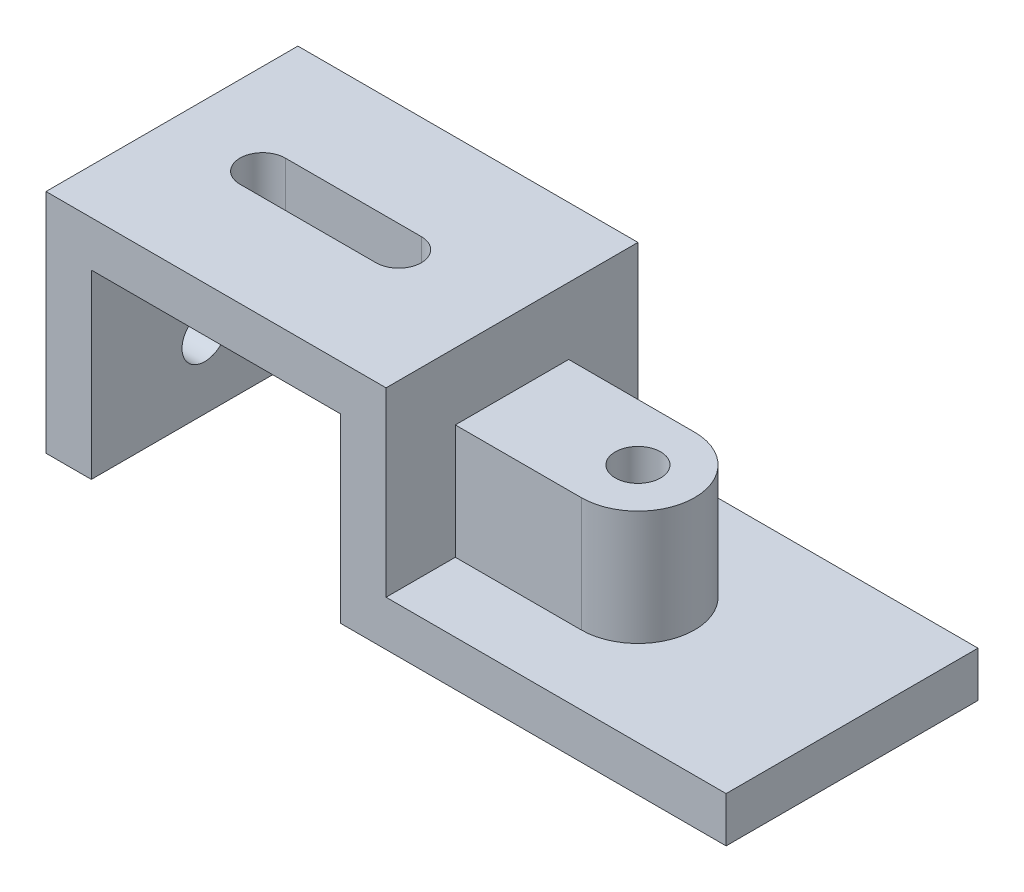
ISO-10303-21;
HEADER;
FILE_DESCRIPTION(('STEP AP214'),'2;1');
FILE_NAME('part.step','',(''),(''),'','','');
FILE_SCHEMA(('AUTOMOTIVE_DESIGN { 1 0 10303 214 1 1 1 1 }'));
ENDSEC;
DATA;
#1=APPLICATION_CONTEXT('core data for automotive mechanical design processes');
#2=APPLICATION_PROTOCOL_DEFINITION('international standard','automotive_design',2000,#1);
#3=PRODUCT_CONTEXT('',#1,'mechanical');
#4=PRODUCT('Part','Part','',(#3));
#5=PRODUCT_RELATED_PRODUCT_CATEGORY('part','',(#4));
#6=PRODUCT_DEFINITION_FORMATION('','',#4);
#7=PRODUCT_DEFINITION_CONTEXT('part definition',#1,'design');
#8=PRODUCT_DEFINITION('design','',#6,#7);
#9=PRODUCT_DEFINITION_SHAPE('','',#8);
#10=(LENGTH_UNIT() NAMED_UNIT(*) SI_UNIT(.MILLI.,.METRE.));
#11=(NAMED_UNIT(*) PLANE_ANGLE_UNIT() SI_UNIT($,.RADIAN.));
#12=(NAMED_UNIT(*) SI_UNIT($,.STERADIAN.) SOLID_ANGLE_UNIT());
#13=UNCERTAINTY_MEASURE_WITH_UNIT(LENGTH_MEASURE(1.E-05),#10,'distance_accuracy_value','');
#14=(GEOMETRIC_REPRESENTATION_CONTEXT(3) GLOBAL_UNCERTAINTY_ASSIGNED_CONTEXT((#13)) GLOBAL_UNIT_ASSIGNED_CONTEXT((#10,
#11,#12)) REPRESENTATION_CONTEXT('',''));
#15=CARTESIAN_POINT('',(0.,0.,0.));
#16=DIRECTION('',(0.,0.,1.));
#17=DIRECTION('',(1.,0.,0.));
#18=AXIS2_PLACEMENT_3D('',#15,#16,#17);
#19=CARTESIAN_POINT('',(0.,0.,100.));
#20=DIRECTION('',(1.,0.,0.));
#21=DIRECTION('',(0.,0.,-1.));
#22=AXIS2_PLACEMENT_3D('',#19,#20,#21);
#23=PLANE('',#22);
#24=DIRECTION('',(0.,-1.,0.));
#25=VECTOR('',#24,1.);
#26=CARTESIAN_POINT('',(0.,0.,0.));
#27=LINE('',#26,#25);
#28=CARTESIAN_POINT('',(0.,90.,0.));
#29=VERTEX_POINT('',#28);
#30=CARTESIAN_POINT('',(0.,0.,0.));
#31=VERTEX_POINT('',#30);
#32=EDGE_CURVE('E252',#29,#31,#27,.T.);
#33=ORIENTED_EDGE('',*,*,#32,.T.);
#34=DIRECTION('',(0.,0.,-1.));
#35=VECTOR('',#34,1.);
#36=CARTESIAN_POINT('',(0.,0.,100.));
#37=LINE('',#36,#35);
#38=CARTESIAN_POINT('',(0.,0.,100.));
#39=VERTEX_POINT('',#38);
#40=EDGE_CURVE('E279',#39,#31,#37,.T.);
#41=ORIENTED_EDGE('',*,*,#40,.F.);
#42=DIRECTION('',(0.,-1.,0.));
#43=VECTOR('',#42,1.);
#44=CARTESIAN_POINT('',(0.,0.,100.));
#45=LINE('',#44,#43);
#46=CARTESIAN_POINT('',(0.,90.,100.));
#47=VERTEX_POINT('',#46);
#48=EDGE_CURVE('E276',#47,#39,#45,.T.);
#49=ORIENTED_EDGE('',*,*,#48,.F.);
#50=DIRECTION('',(0.,0.,-1.));
#51=VECTOR('',#50,1.);
#52=CARTESIAN_POINT('',(0.,90.,100.));
#53=LINE('',#52,#51);
#54=EDGE_CURVE('E313',#47,#29,#53,.T.);
#55=ORIENTED_EDGE('',*,*,#54,.T.);
#56=EDGE_LOOP('',(#33,#41,#49,#55));
#57=FACE_BOUND('',#56,.T.);
#58=CARTESIAN_POINT('',(0.,27.,55.));
#59=DIRECTION('',(-1.,0.,0.));
#60=DIRECTION('',(0.,0.,1.));
#61=AXIS2_PLACEMENT_3D('',#58,#59,#60);
#62=CIRCLE('',#61,9.00000000000001);
#63=CARTESIAN_POINT('',(0.,27.,64.));
#64=VERTEX_POINT('',#63);
#65=EDGE_CURVE('E578',#64,#64,#62,.T.);
#66=ORIENTED_EDGE('',*,*,#65,.F.);
#67=EDGE_LOOP('',(#66));
#68=FACE_BOUND('',#67,.T.);
#69=ADVANCED_FACE('F45',(#57,#68),#23,.F.);
#70=CARTESIAN_POINT('',(135.,18.,100.));
#71=DIRECTION('',(0.,-1.,0.));
#72=DIRECTION('',(1.,0.,0.));
#73=AXIS2_PLACEMENT_3D('',#70,#71,#72);
#74=PLANE('',#73);
#75=DIRECTION('',(1.,0.,0.));
#76=VECTOR('',#75,1.);
#77=CARTESIAN_POINT('',(185.,18.,72.5));
#78=LINE('',#77,#76);
#79=CARTESIAN_POINT('',(135.,18.,72.5));
#80=VERTEX_POINT('',#79);
#81=CARTESIAN_POINT('',(185.,18.,72.5));
#82=VERTEX_POINT('',#81);
#83=EDGE_CURVE('E591',#80,#82,#78,.T.);
#84=ORIENTED_EDGE('',*,*,#83,.F.);
#85=DIRECTION('',(0.,0.,-1.));
#86=VECTOR('',#85,1.);
#87=CARTESIAN_POINT('',(135.,18.,100.));
#88=LINE('',#87,#86);
#89=CARTESIAN_POINT('',(135.,18.,100.));
#90=VERTEX_POINT('',#89);
#91=EDGE_CURVE('E196',#90,#80,#88,.T.);
#92=ORIENTED_EDGE('',*,*,#91,.F.);
#93=DIRECTION('',(-1.,0.,0.));
#94=VECTOR('',#93,1.);
#95=CARTESIAN_POINT('',(135.,18.,100.));
#96=LINE('',#95,#94);
#97=CARTESIAN_POINT('',(270.,18.,100.));
#98=VERTEX_POINT('',#97);
#99=EDGE_CURVE('E267',#98,#90,#96,.T.);
#100=ORIENTED_EDGE('',*,*,#99,.F.);
#101=DIRECTION('',(0.,0.,-1.));
#102=VECTOR('',#101,1.);
#103=CARTESIAN_POINT('',(270.,18.,100.));
#104=LINE('',#103,#102);
#105=CARTESIAN_POINT('',(270.,18.,0.));
#106=VERTEX_POINT('',#105);
#107=EDGE_CURVE('E324',#98,#106,#104,.T.);
#108=ORIENTED_EDGE('',*,*,#107,.T.);
#109=DIRECTION('',(-1.,0.,0.));
#110=VECTOR('',#109,1.);
#111=CARTESIAN_POINT('',(135.,18.,0.));
#112=LINE('',#111,#110);
#113=CARTESIAN_POINT('',(135.,18.,0.));
#114=VERTEX_POINT('',#113);
#115=EDGE_CURVE('E298',#106,#114,#112,.T.);
#116=ORIENTED_EDGE('',*,*,#115,.T.);
#117=CARTESIAN_POINT('',(135.,18.,27.5));
#118=VERTEX_POINT('',#117);
#119=EDGE_CURVE('E321',#118,#114,#88,.T.);
#120=ORIENTED_EDGE('',*,*,#119,.F.);
#121=DIRECTION('',(-1.,0.,0.));
#122=VECTOR('',#121,1.);
#123=CARTESIAN_POINT('',(185.,18.,27.5));
#124=LINE('',#123,#122);
#125=CARTESIAN_POINT('',(185.,18.,27.5));
#126=VERTEX_POINT('',#125);
#127=EDGE_CURVE('E190',#126,#118,#124,.T.);
#128=ORIENTED_EDGE('',*,*,#127,.F.);
#129=CARTESIAN_POINT('',(185.,18.,50.));
#130=DIRECTION('',(0.,1.,0.));
#131=DIRECTION('',(-1.,0.,0.));
#132=AXIS2_PLACEMENT_3D('',#129,#130,#131);
#133=CIRCLE('',#132,22.5);
#134=EDGE_CURVE('E599',#82,#126,#133,.T.);
#135=ORIENTED_EDGE('',*,*,#134,.F.);
#136=EDGE_LOOP('',(#84,#92,#100,#108,#116,#120,#128,#135));
#137=FACE_BOUND('',#136,.T.);
#138=ADVANCED_FACE('F385',(#137),#74,.F.);
#139=CARTESIAN_POINT('',(135.,90.,100.));
#140=DIRECTION('',(-1.,0.,0.));
#141=DIRECTION('',(0.,0.,1.));
#142=AXIS2_PLACEMENT_3D('',#139,#140,#141);
#143=PLANE('',#142);
#144=DIRECTION('',(0.,-1.,0.));
#145=VECTOR('',#144,1.);
#146=CARTESIAN_POINT('',(135.,63.5,72.5));
#147=LINE('',#146,#145);
#148=CARTESIAN_POINT('',(135.,63.5,72.5));
#149=VERTEX_POINT('',#148);
#150=EDGE_CURVE('E175',#149,#80,#147,.T.);
#151=ORIENTED_EDGE('',*,*,#150,.F.);
#152=DIRECTION('',(0.,0.,1.));
#153=VECTOR('',#152,1.);
#154=CARTESIAN_POINT('',(135.,63.5,72.5));
#155=LINE('',#154,#153);
#156=CARTESIAN_POINT('',(135.,63.5,27.5));
#157=VERTEX_POINT('',#156);
#158=EDGE_CURVE('E183',#157,#149,#155,.T.);
#159=ORIENTED_EDGE('',*,*,#158,.F.);
#160=DIRECTION('',(0.,-1.,0.));
#161=VECTOR('',#160,1.);
#162=CARTESIAN_POINT('',(135.,63.5,27.5));
#163=LINE('',#162,#161);
#164=EDGE_CURVE('E61',#157,#118,#163,.T.);
#165=ORIENTED_EDGE('',*,*,#164,.T.);
#166=ORIENTED_EDGE('',*,*,#119,.T.);
#167=DIRECTION('',(0.,1.,0.));
#168=VECTOR('',#167,1.);
#169=CARTESIAN_POINT('',(135.,90.,0.));
#170=LINE('',#169,#168);
#171=CARTESIAN_POINT('',(135.,90.,0.));
#172=VERTEX_POINT('',#171);
#173=EDGE_CURVE('E302',#114,#172,#170,.T.);
#174=ORIENTED_EDGE('',*,*,#173,.T.);
#175=DIRECTION('',(0.,0.,-1.));
#176=VECTOR('',#175,1.);
#177=CARTESIAN_POINT('',(135.,90.,100.));
#178=LINE('',#177,#176);
#179=CARTESIAN_POINT('',(135.,90.,100.));
#180=VERTEX_POINT('',#179);
#181=EDGE_CURVE('E317',#180,#172,#178,.T.);
#182=ORIENTED_EDGE('',*,*,#181,.F.);
#183=DIRECTION('',(0.,1.,0.));
#184=VECTOR('',#183,1.);
#185=CARTESIAN_POINT('',(135.,90.,100.));
#186=LINE('',#185,#184);
#187=EDGE_CURVE('E270',#90,#180,#186,.T.);
#188=ORIENTED_EDGE('',*,*,#187,.F.);
#189=ORIENTED_EDGE('',*,*,#91,.T.);
#190=EDGE_LOOP('',(#151,#159,#165,#166,#174,#182,#188,#189));
#191=FACE_BOUND('',#190,.T.);
#192=ADVANCED_FACE('F193',(#191),#143,.F.);
#193=CARTESIAN_POINT('',(18.,0.,100.));
#194=DIRECTION('',(0.,1.,0.));
#195=DIRECTION('',(-1.,0.,0.));
#196=AXIS2_PLACEMENT_3D('',#193,#194,#195);
#197=PLANE('',#196);
#198=DIRECTION('',(1.,0.,0.));
#199=VECTOR('',#198,1.);
#200=CARTESIAN_POINT('',(18.,0.,0.));
#201=LINE('',#200,#199);
#202=CARTESIAN_POINT('',(18.,0.,0.));
#203=VERTEX_POINT('',#202);
#204=EDGE_CURVE('E246',#31,#203,#201,.T.);
#205=ORIENTED_EDGE('',*,*,#204,.T.);
#206=DIRECTION('',(0.,0.,-1.));
#207=VECTOR('',#206,1.);
#208=CARTESIAN_POINT('',(18.,0.,100.));
#209=LINE('',#208,#207);
#210=CARTESIAN_POINT('',(18.,0.,100.));
#211=VERTEX_POINT('',#210);
#212=EDGE_CURVE('E11',#211,#203,#209,.T.);
#213=ORIENTED_EDGE('',*,*,#212,.F.);
#214=DIRECTION('',(1.,0.,0.));
#215=VECTOR('',#214,1.);
#216=CARTESIAN_POINT('',(18.,0.,100.));
#217=LINE('',#216,#215);
#218=EDGE_CURVE('E247',#39,#211,#217,.T.);
#219=ORIENTED_EDGE('',*,*,#218,.F.);
#220=ORIENTED_EDGE('',*,*,#40,.T.);
#221=EDGE_LOOP('',(#205,#213,#219,#220));
#222=FACE_BOUND('',#221,.T.);
#223=ADVANCED_FACE('F47',(#222),#197,.F.);
#224=CARTESIAN_POINT('',(18.,72.,100.));
#225=DIRECTION('',(-1.,0.,0.));
#226=DIRECTION('',(0.,-1.,0.));
#227=AXIS2_PLACEMENT_3D('',#224,#225,#226);
#228=PLANE('',#227);
#229=CARTESIAN_POINT('',(18.,27.,55.));
#230=DIRECTION('',(-1.,0.,0.));
#231=DIRECTION('',(0.,-1.,0.));
#232=AXIS2_PLACEMENT_3D('',#229,#230,#231);
#233=CIRCLE('',#232,9.00000000000001);
#234=CARTESIAN_POINT('',(18.,18.,55.));
#235=VERTEX_POINT('',#234);
#236=EDGE_CURVE('E575',#235,#235,#233,.T.);
#237=ORIENTED_EDGE('',*,*,#236,.T.);
#238=EDGE_LOOP('',(#237));
#239=FACE_BOUND('',#238,.T.);
#240=DIRECTION('',(0.,1.,0.));
#241=VECTOR('',#240,1.);
#242=CARTESIAN_POINT('',(18.,72.,0.));
#243=LINE('',#242,#241);
#244=CARTESIAN_POINT('',(18.,72.,0.));
#245=VERTEX_POINT('',#244);
#246=EDGE_CURVE('E283',#203,#245,#243,.T.);
#247=ORIENTED_EDGE('',*,*,#246,.T.);
#248=DIRECTION('',(0.,0.,-1.));
#249=VECTOR('',#248,1.);
#250=CARTESIAN_POINT('',(18.,72.,100.));
#251=LINE('',#250,#249);
#252=CARTESIAN_POINT('',(18.,72.,100.));
#253=VERTEX_POINT('',#252);
#254=EDGE_CURVE('E54',#253,#245,#251,.T.);
#255=ORIENTED_EDGE('',*,*,#254,.F.);
#256=DIRECTION('',(0.,1.,0.));
#257=VECTOR('',#256,1.);
#258=CARTESIAN_POINT('',(18.,72.,100.));
#259=LINE('',#258,#257);
#260=EDGE_CURVE('E251',#211,#253,#259,.T.);
#261=ORIENTED_EDGE('',*,*,#260,.F.);
#262=ORIENTED_EDGE('',*,*,#212,.T.);
#263=EDGE_LOOP('',(#247,#255,#261,#262));
#264=FACE_BOUND('',#263,.T.);
#265=ADVANCED_FACE('F368',(#239,#264),#228,.F.);
#266=CARTESIAN_POINT('',(117.,72.,100.));
#267=DIRECTION('',(0.,1.,0.));
#268=DIRECTION('',(-1.,0.,0.));
#269=AXIS2_PLACEMENT_3D('',#266,#267,#268);
#270=PLANE('',#269);
#271=DIRECTION('',(-1.,0.,0.));
#272=VECTOR('',#271,1.);
#273=CARTESIAN_POINT('',(117.,72.,41.));
#274=LINE('',#273,#272);
#275=CARTESIAN_POINT('',(90.,72.,41.));
#276=VERTEX_POINT('',#275);
#277=CARTESIAN_POINT('',(36.,72.,41.));
#278=VERTEX_POINT('',#277);
#279=EDGE_CURVE('E238',#276,#278,#274,.T.);
#280=ORIENTED_EDGE('',*,*,#279,.T.);
#281=CARTESIAN_POINT('',(36.,72.,50.));
#282=DIRECTION('',(0.,1.,0.));
#283=DIRECTION('',(-1.,0.,0.));
#284=AXIS2_PLACEMENT_3D('',#281,#282,#283);
#285=CIRCLE('',#284,9.00000000000001);
#286=CARTESIAN_POINT('',(36.,72.,59.));
#287=VERTEX_POINT('',#286);
#288=EDGE_CURVE('E242',#278,#287,#285,.T.);
#289=ORIENTED_EDGE('',*,*,#288,.T.);
#290=DIRECTION('',(1.,0.,0.));
#291=VECTOR('',#290,1.);
#292=CARTESIAN_POINT('',(117.,72.,59.));
#293=LINE('',#292,#291);
#294=CARTESIAN_POINT('',(90.,72.,59.));
#295=VERTEX_POINT('',#294);
#296=EDGE_CURVE('E222',#287,#295,#293,.T.);
#297=ORIENTED_EDGE('',*,*,#296,.T.);
#298=CARTESIAN_POINT('',(90.,72.,50.));
#299=DIRECTION('',(0.,1.,0.));
#300=DIRECTION('',(-1.,0.,0.));
#301=AXIS2_PLACEMENT_3D('',#298,#299,#300);
#302=CIRCLE('',#301,9.00000000000001);
#303=EDGE_CURVE('E234',#295,#276,#302,.T.);
#304=ORIENTED_EDGE('',*,*,#303,.T.);
#305=EDGE_LOOP('',(#280,#289,#297,#304));
#306=FACE_BOUND('',#305,.T.);
#307=DIRECTION('',(1.,0.,0.));
#308=VECTOR('',#307,1.);
#309=CARTESIAN_POINT('',(117.,72.,0.));
#310=LINE('',#309,#308);
#311=CARTESIAN_POINT('',(117.,72.,0.));
#312=VERTEX_POINT('',#311);
#313=EDGE_CURVE('E286',#245,#312,#310,.T.);
#314=ORIENTED_EDGE('',*,*,#313,.T.);
#315=DIRECTION('',(0.,0.,-1.));
#316=VECTOR('',#315,1.);
#317=CARTESIAN_POINT('',(117.,72.,100.));
#318=LINE('',#317,#316);
#319=CARTESIAN_POINT('',(117.,72.,100.));
#320=VERTEX_POINT('',#319);
#321=EDGE_CURVE('E336',#320,#312,#318,.T.);
#322=ORIENTED_EDGE('',*,*,#321,.F.);
#323=DIRECTION('',(1.,0.,0.));
#324=VECTOR('',#323,1.);
#325=CARTESIAN_POINT('',(117.,72.,100.));
#326=LINE('',#325,#324);
#327=EDGE_CURVE('E255',#253,#320,#326,.T.);
#328=ORIENTED_EDGE('',*,*,#327,.F.);
#329=ORIENTED_EDGE('',*,*,#254,.T.);
#330=EDGE_LOOP('',(#314,#322,#328,#329));
#331=FACE_BOUND('',#330,.T.);
#332=ADVANCED_FACE('F345',(#306,#331),#270,.F.);
#333=CARTESIAN_POINT('',(117.,0.,100.));
#334=DIRECTION('',(1.,0.,0.));
#335=DIRECTION('',(0.,1.,0.));
#336=AXIS2_PLACEMENT_3D('',#333,#334,#335);
#337=PLANE('',#336);
#338=DIRECTION('',(0.,-1.,0.));
#339=VECTOR('',#338,1.);
#340=CARTESIAN_POINT('',(117.,0.,0.));
#341=LINE('',#340,#339);
#342=CARTESIAN_POINT('',(117.,0.,0.));
#343=VERTEX_POINT('',#342);
#344=EDGE_CURVE('E289',#312,#343,#341,.T.);
#345=ORIENTED_EDGE('',*,*,#344,.T.);
#346=DIRECTION('',(0.,0.,-1.));
#347=VECTOR('',#346,1.);
#348=CARTESIAN_POINT('',(117.,0.,100.));
#349=LINE('',#348,#347);
#350=CARTESIAN_POINT('',(117.,0.,100.));
#351=VERTEX_POINT('',#350);
#352=EDGE_CURVE('E332',#351,#343,#349,.T.);
#353=ORIENTED_EDGE('',*,*,#352,.F.);
#354=DIRECTION('',(0.,-1.,0.));
#355=VECTOR('',#354,1.);
#356=CARTESIAN_POINT('',(117.,0.,100.));
#357=LINE('',#356,#355);
#358=EDGE_CURVE('E258',#320,#351,#357,.T.);
#359=ORIENTED_EDGE('',*,*,#358,.F.);
#360=ORIENTED_EDGE('',*,*,#321,.T.);
#361=EDGE_LOOP('',(#345,#353,#359,#360));
#362=FACE_BOUND('',#361,.T.);
#363=ADVANCED_FACE('F356',(#362),#337,.F.);
#364=CARTESIAN_POINT('',(270.,0.,100.));
#365=DIRECTION('',(0.,1.,0.));
#366=DIRECTION('',(-1.,0.,0.));
#367=AXIS2_PLACEMENT_3D('',#364,#365,#366);
#368=PLANE('',#367);
#369=CARTESIAN_POINT('',(185.,0.,50.));
#370=DIRECTION('',(0.,1.,0.));
#371=DIRECTION('',(-1.,0.,0.));
#372=AXIS2_PLACEMENT_3D('',#369,#370,#371);
#373=CIRCLE('',#372,9.00000000000001);
#374=CARTESIAN_POINT('',(176.,0.,50.));
#375=VERTEX_POINT('',#374);
#376=EDGE_CURVE('E588',#375,#375,#373,.T.);
#377=ORIENTED_EDGE('',*,*,#376,.T.);
#378=EDGE_LOOP('',(#377));
#379=FACE_BOUND('',#378,.T.);
#380=DIRECTION('',(1.,0.,0.));
#381=VECTOR('',#380,1.);
#382=CARTESIAN_POINT('',(270.,0.,0.));
#383=LINE('',#382,#381);
#384=CARTESIAN_POINT('',(270.,0.,0.));
#385=VERTEX_POINT('',#384);
#386=EDGE_CURVE('E292',#343,#385,#383,.T.);
#387=ORIENTED_EDGE('',*,*,#386,.T.);
#388=DIRECTION('',(0.,0.,-1.));
#389=VECTOR('',#388,1.);
#390=CARTESIAN_POINT('',(270.,0.,100.));
#391=LINE('',#390,#389);
#392=CARTESIAN_POINT('',(270.,0.,100.));
#393=VERTEX_POINT('',#392);
#394=EDGE_CURVE('E328',#393,#385,#391,.T.);
#395=ORIENTED_EDGE('',*,*,#394,.F.);
#396=DIRECTION('',(1.,0.,0.));
#397=VECTOR('',#396,1.);
#398=CARTESIAN_POINT('',(270.,0.,100.));
#399=LINE('',#398,#397);
#400=EDGE_CURVE('E261',#351,#393,#399,.T.);
#401=ORIENTED_EDGE('',*,*,#400,.F.);
#402=ORIENTED_EDGE('',*,*,#352,.T.);
#403=EDGE_LOOP('',(#387,#395,#401,#402));
#404=FACE_BOUND('',#403,.T.);
#405=ADVANCED_FACE('F360',(#379,#404),#368,.F.);
#406=CARTESIAN_POINT('',(270.,18.,100.));
#407=DIRECTION('',(-1.,0.,0.));
#408=DIRECTION('',(0.,-1.,0.));
#409=AXIS2_PLACEMENT_3D('',#406,#407,#408);
#410=PLANE('',#409);
#411=DIRECTION('',(0.,1.,0.));
#412=VECTOR('',#411,1.);
#413=CARTESIAN_POINT('',(270.,18.,0.));
#414=LINE('',#413,#412);
#415=EDGE_CURVE('E295',#385,#106,#414,.T.);
#416=ORIENTED_EDGE('',*,*,#415,.T.);
#417=ORIENTED_EDGE('',*,*,#107,.F.);
#418=DIRECTION('',(0.,1.,0.));
#419=VECTOR('',#418,1.);
#420=CARTESIAN_POINT('',(270.,18.,100.));
#421=LINE('',#420,#419);
#422=EDGE_CURVE('E264',#393,#98,#421,.T.);
#423=ORIENTED_EDGE('',*,*,#422,.F.);
#424=ORIENTED_EDGE('',*,*,#394,.T.);
#425=EDGE_LOOP('',(#416,#417,#423,#424));
#426=FACE_BOUND('',#425,.T.);
#427=ADVANCED_FACE('F389',(#426),#410,.F.);
#428=CARTESIAN_POINT('',(0.,90.,100.));
#429=DIRECTION('',(0.,-1.,0.));
#430=DIRECTION('',(1.,0.,0.));
#431=AXIS2_PLACEMENT_3D('',#428,#429,#430);
#432=PLANE('',#431);
#433=DIRECTION('',(1.,0.,0.));
#434=VECTOR('',#433,1.);
#435=CARTESIAN_POINT('',(36.,90.,59.));
#436=LINE('',#435,#434);
#437=CARTESIAN_POINT('',(36.,90.,59.));
#438=VERTEX_POINT('',#437);
#439=CARTESIAN_POINT('',(90.,90.,59.));
#440=VERTEX_POINT('',#439);
#441=EDGE_CURVE('E202',#438,#440,#436,.T.);
#442=ORIENTED_EDGE('',*,*,#441,.F.);
#443=CARTESIAN_POINT('',(36.,90.,50.));
#444=DIRECTION('',(0.,1.,0.));
#445=DIRECTION('',(-1.,0.,0.));
#446=AXIS2_PLACEMENT_3D('',#443,#444,#445);
#447=CIRCLE('',#446,9.00000000000001);
#448=CARTESIAN_POINT('',(36.,90.,41.));
#449=VERTEX_POINT('',#448);
#450=EDGE_CURVE('E198',#449,#438,#447,.T.);
#451=ORIENTED_EDGE('',*,*,#450,.F.);
#452=DIRECTION('',(-1.,0.,0.));
#453=VECTOR('',#452,1.);
#454=CARTESIAN_POINT('',(36.,90.,41.));
#455=LINE('',#454,#453);
#456=CARTESIAN_POINT('',(90.,90.,41.));
#457=VERTEX_POINT('',#456);
#458=EDGE_CURVE('E214',#457,#449,#455,.T.);
#459=ORIENTED_EDGE('',*,*,#458,.F.);
#460=CARTESIAN_POINT('',(90.,90.,50.));
#461=DIRECTION('',(0.,1.,0.));
#462=DIRECTION('',(-1.,0.,0.));
#463=AXIS2_PLACEMENT_3D('',#460,#461,#462);
#464=CIRCLE('',#463,9.00000000000001);
#465=EDGE_CURVE('E210',#440,#457,#464,.T.);
#466=ORIENTED_EDGE('',*,*,#465,.F.);
#467=EDGE_LOOP('',(#442,#451,#459,#466));
#468=FACE_BOUND('',#467,.T.);
#469=DIRECTION('',(-1.,0.,0.));
#470=VECTOR('',#469,1.);
#471=CARTESIAN_POINT('',(0.,90.,0.));
#472=LINE('',#471,#470);
#473=EDGE_CURVE('E305',#172,#29,#472,.T.);
#474=ORIENTED_EDGE('',*,*,#473,.T.);
#475=ORIENTED_EDGE('',*,*,#54,.F.);
#476=DIRECTION('',(-1.,0.,0.));
#477=VECTOR('',#476,1.);
#478=CARTESIAN_POINT('',(0.,90.,100.));
#479=LINE('',#478,#477);
#480=EDGE_CURVE('E273',#180,#47,#479,.T.);
#481=ORIENTED_EDGE('',*,*,#480,.F.);
#482=ORIENTED_EDGE('',*,*,#181,.T.);
#483=EDGE_LOOP('',(#474,#475,#481,#482));
#484=FACE_BOUND('',#483,.T.);
#485=ADVANCED_FACE('F380',(#468,#484),#432,.F.);
#486=CARTESIAN_POINT('',(0.,0.,100.));
#487=DIRECTION('',(0.,0.,-1.));
#488=DIRECTION('',(-1.,0.,0.));
#489=AXIS2_PLACEMENT_3D('',#486,#487,#488);
#490=PLANE('',#489);
#491=ORIENTED_EDGE('',*,*,#218,.T.);
#492=ORIENTED_EDGE('',*,*,#260,.T.);
#493=ORIENTED_EDGE('',*,*,#327,.T.);
#494=ORIENTED_EDGE('',*,*,#358,.T.);
#495=ORIENTED_EDGE('',*,*,#400,.T.);
#496=ORIENTED_EDGE('',*,*,#422,.T.);
#497=ORIENTED_EDGE('',*,*,#99,.T.);
#498=ORIENTED_EDGE('',*,*,#187,.T.);
#499=ORIENTED_EDGE('',*,*,#480,.T.);
#500=ORIENTED_EDGE('',*,*,#48,.T.);
#501=EDGE_LOOP('',(#491,#492,#493,#494,#495,#496,#497,#498,#499,#500));
#502=FACE_BOUND('',#501,.T.);
#503=ADVANCED_FACE('F364',(#502),#490,.F.);
#504=CARTESIAN_POINT('',(0.,0.,0.));
#505=DIRECTION('',(0.,0.,-1.));
#506=DIRECTION('',(-1.,0.,0.));
#507=AXIS2_PLACEMENT_3D('',#504,#505,#506);
#508=PLANE('',#507);
#509=ORIENTED_EDGE('',*,*,#204,.F.);
#510=ORIENTED_EDGE('',*,*,#32,.F.);
#511=ORIENTED_EDGE('',*,*,#473,.F.);
#512=ORIENTED_EDGE('',*,*,#173,.F.);
#513=ORIENTED_EDGE('',*,*,#115,.F.);
#514=ORIENTED_EDGE('',*,*,#415,.F.);
#515=ORIENTED_EDGE('',*,*,#386,.F.);
#516=ORIENTED_EDGE('',*,*,#344,.F.);
#517=ORIENTED_EDGE('',*,*,#313,.F.);
#518=ORIENTED_EDGE('',*,*,#246,.F.);
#519=EDGE_LOOP('',(#509,#510,#511,#512,#513,#514,#515,#516,#517,#518));
#520=FACE_BOUND('',#519,.T.);
#521=ADVANCED_FACE('F351',(#520),#508,.T.);
#522=CARTESIAN_POINT('',(36.,-10.,50.));
#523=DIRECTION('',(0.,1.,0.));
#524=DIRECTION('',(-1.,0.,0.));
#525=AXIS2_PLACEMENT_3D('',#522,#523,#524);
#526=CYLINDRICAL_SURFACE('',#525,9.00000000000001);
#527=DIRECTION('',(0.,1.,0.));
#528=VECTOR('',#527,1.);
#529=CARTESIAN_POINT('',(36.,-10.,41.));
#530=LINE('',#529,#528);
#531=EDGE_CURVE('E219',#278,#449,#530,.T.);
#532=ORIENTED_EDGE('',*,*,#531,.T.);
#533=ORIENTED_EDGE('',*,*,#450,.T.);
#534=DIRECTION('',(0.,1.,0.));
#535=VECTOR('',#534,1.);
#536=CARTESIAN_POINT('',(36.,-10.,59.));
#537=LINE('',#536,#535);
#538=EDGE_CURVE('E218',#287,#438,#537,.T.);
#539=ORIENTED_EDGE('',*,*,#538,.F.);
#540=ORIENTED_EDGE('',*,*,#288,.F.);
#541=EDGE_LOOP('',(#532,#533,#539,#540));
#542=FACE_BOUND('',#541,.T.);
#543=ADVANCED_FACE('F470',(#542),#526,.F.);
#544=CARTESIAN_POINT('',(36.,-10.,41.));
#545=DIRECTION('',(0.,0.,-1.));
#546=DIRECTION('',(-1.,0.,0.));
#547=AXIS2_PLACEMENT_3D('',#544,#545,#546);
#548=PLANE('',#547);
#549=DIRECTION('',(0.,1.,0.));
#550=VECTOR('',#549,1.);
#551=CARTESIAN_POINT('',(90.,-10.,41.));
#552=LINE('',#551,#550);
#553=EDGE_CURVE('E223',#276,#457,#552,.T.);
#554=ORIENTED_EDGE('',*,*,#553,.T.);
#555=ORIENTED_EDGE('',*,*,#458,.T.);
#556=ORIENTED_EDGE('',*,*,#531,.F.);
#557=ORIENTED_EDGE('',*,*,#279,.F.);
#558=EDGE_LOOP('',(#554,#555,#556,#557));
#559=FACE_BOUND('',#558,.T.);
#560=ADVANCED_FACE('F477',(#559),#548,.F.);
#561=CARTESIAN_POINT('',(90.,-10.,50.));
#562=DIRECTION('',(0.,1.,0.));
#563=DIRECTION('',(-1.,0.,0.));
#564=AXIS2_PLACEMENT_3D('',#561,#562,#563);
#565=CYLINDRICAL_SURFACE('',#564,9.00000000000001);
#566=DIRECTION('',(0.,1.,0.));
#567=VECTOR('',#566,1.);
#568=CARTESIAN_POINT('',(90.,-10.,59.));
#569=LINE('',#568,#567);
#570=EDGE_CURVE('E69',#295,#440,#569,.T.);
#571=ORIENTED_EDGE('',*,*,#570,.T.);
#572=ORIENTED_EDGE('',*,*,#465,.T.);
#573=ORIENTED_EDGE('',*,*,#553,.F.);
#574=ORIENTED_EDGE('',*,*,#303,.F.);
#575=EDGE_LOOP('',(#571,#572,#573,#574));
#576=FACE_BOUND('',#575,.T.);
#577=ADVANCED_FACE('F487',(#576),#565,.F.);
#578=CARTESIAN_POINT('',(36.,-10.,59.));
#579=DIRECTION('',(0.,0.,1.));
#580=DIRECTION('',(1.,0.,0.));
#581=AXIS2_PLACEMENT_3D('',#578,#579,#580);
#582=PLANE('',#581);
#583=ORIENTED_EDGE('',*,*,#538,.T.);
#584=ORIENTED_EDGE('',*,*,#441,.T.);
#585=ORIENTED_EDGE('',*,*,#570,.F.);
#586=ORIENTED_EDGE('',*,*,#296,.F.);
#587=EDGE_LOOP('',(#583,#584,#585,#586));
#588=FACE_BOUND('',#587,.T.);
#589=ADVANCED_FACE('F497',(#588),#582,.F.);
#590=CARTESIAN_POINT('',(185.,63.5,72.5));
#591=DIRECTION('',(0.,0.,-1.));
#592=DIRECTION('',(-1.,0.,0.));
#593=AXIS2_PLACEMENT_3D('',#590,#591,#592);
#594=PLANE('',#593);
#595=ORIENTED_EDGE('',*,*,#83,.T.);
#596=DIRECTION('',(0.,-1.,0.));
#597=VECTOR('',#596,1.);
#598=CARTESIAN_POINT('',(185.,63.5,72.5));
#599=LINE('',#598,#597);
#600=CARTESIAN_POINT('',(185.,63.5,72.5));
#601=VERTEX_POINT('',#600);
#602=EDGE_CURVE('E178',#601,#82,#599,.T.);
#603=ORIENTED_EDGE('',*,*,#602,.F.);
#604=DIRECTION('',(1.,0.,0.));
#605=VECTOR('',#604,1.);
#606=CARTESIAN_POINT('',(185.,63.5,72.5));
#607=LINE('',#606,#605);
#608=EDGE_CURVE('E171',#149,#601,#607,.T.);
#609=ORIENTED_EDGE('',*,*,#608,.F.);
#610=ORIENTED_EDGE('',*,*,#150,.T.);
#611=EDGE_LOOP('',(#595,#603,#609,#610));
#612=FACE_BOUND('',#611,.T.);
#613=ADVANCED_FACE('F173',(#612),#594,.F.);
#614=CARTESIAN_POINT('',(185.,63.5,50.));
#615=DIRECTION('',(0.,-1.,0.));
#616=DIRECTION('',(1.,0.,0.));
#617=AXIS2_PLACEMENT_3D('',#614,#615,#616);
#618=CYLINDRICAL_SURFACE('',#617,22.5);
#619=ORIENTED_EDGE('',*,*,#134,.T.);
#620=DIRECTION('',(0.,-1.,0.));
#621=VECTOR('',#620,1.);
#622=CARTESIAN_POINT('',(185.,63.5,27.5));
#623=LINE('',#622,#621);
#624=CARTESIAN_POINT('',(185.,63.5,27.5));
#625=VERTEX_POINT('',#624);
#626=EDGE_CURVE('E204',#625,#126,#623,.T.);
#627=ORIENTED_EDGE('',*,*,#626,.F.);
#628=CARTESIAN_POINT('',(185.,63.5,50.));
#629=DIRECTION('',(0.,1.,0.));
#630=DIRECTION('',(-1.,0.,0.));
#631=AXIS2_PLACEMENT_3D('',#628,#629,#630);
#632=CIRCLE('',#631,22.5);
#633=EDGE_CURVE('E182',#601,#625,#632,.T.);
#634=ORIENTED_EDGE('',*,*,#633,.F.);
#635=ORIENTED_EDGE('',*,*,#602,.T.);
#636=EDGE_LOOP('',(#619,#627,#634,#635));
#637=FACE_BOUND('',#636,.T.);
#638=ADVANCED_FACE('F523',(#637),#618,.T.);
#639=CARTESIAN_POINT('',(185.,63.5,27.5));
#640=DIRECTION('',(0.,0.,1.));
#641=DIRECTION('',(1.,0.,0.));
#642=AXIS2_PLACEMENT_3D('',#639,#640,#641);
#643=PLANE('',#642);
#644=ORIENTED_EDGE('',*,*,#127,.T.);
#645=ORIENTED_EDGE('',*,*,#164,.F.);
#646=DIRECTION('',(-1.,0.,0.));
#647=VECTOR('',#646,1.);
#648=CARTESIAN_POINT('',(185.,63.5,27.5));
#649=LINE('',#648,#647);
#650=EDGE_CURVE('E187',#625,#157,#649,.T.);
#651=ORIENTED_EDGE('',*,*,#650,.F.);
#652=ORIENTED_EDGE('',*,*,#626,.T.);
#653=EDGE_LOOP('',(#644,#645,#651,#652));
#654=FACE_BOUND('',#653,.T.);
#655=ADVANCED_FACE('F532',(#654),#643,.F.);
#656=CARTESIAN_POINT('',(185.,63.5,50.));
#657=DIRECTION('',(0.,1.,0.));
#658=DIRECTION('',(-1.,0.,0.));
#659=AXIS2_PLACEMENT_3D('',#656,#657,#658);
#660=PLANE('',#659);
#661=CARTESIAN_POINT('',(185.,63.5,50.));
#662=DIRECTION('',(0.,1.,0.));
#663=DIRECTION('',(0.,0.,1.));
#664=AXIS2_PLACEMENT_3D('',#661,#662,#663);
#665=CIRCLE('',#664,9.00000000000001);
#666=CARTESIAN_POINT('',(185.,63.5,59.));
#667=VERTEX_POINT('',#666);
#668=EDGE_CURVE('E582',#667,#667,#665,.T.);
#669=ORIENTED_EDGE('',*,*,#668,.F.);
#670=EDGE_LOOP('',(#669));
#671=FACE_BOUND('',#670,.T.);
#672=ORIENTED_EDGE('',*,*,#158,.T.);
#673=ORIENTED_EDGE('',*,*,#608,.T.);
#674=ORIENTED_EDGE('',*,*,#633,.T.);
#675=ORIENTED_EDGE('',*,*,#650,.T.);
#676=EDGE_LOOP('',(#672,#673,#674,#675));
#677=FACE_BOUND('',#676,.T.);
#678=ADVANCED_FACE('F186',(#671,#677),#660,.T.);
#679=CARTESIAN_POINT('',(185.,63.5,50.));
#680=DIRECTION('',(0.,1.,0.));
#681=DIRECTION('',(0.,0.,1.));
#682=AXIS2_PLACEMENT_3D('',#679,#680,#681);
#683=CYLINDRICAL_SURFACE('',#682,9.00000000000001);
#684=ORIENTED_EDGE('',*,*,#376,.F.);
#685=EDGE_LOOP('',(#684));
#686=FACE_BOUND('',#685,.T.);
#687=ORIENTED_EDGE('',*,*,#668,.T.);
#688=EDGE_LOOP('',(#687));
#689=FACE_BOUND('',#688,.T.);
#690=ADVANCED_FACE('F548',(#686,#689),#683,.F.);
#691=CARTESIAN_POINT('',(0.,27.,55.));
#692=DIRECTION('',(-1.,0.,0.));
#693=DIRECTION('',(0.,0.,1.));
#694=AXIS2_PLACEMENT_3D('',#691,#692,#693);
#695=CYLINDRICAL_SURFACE('',#694,9.00000000000001);
#696=ORIENTED_EDGE('',*,*,#236,.F.);
#697=EDGE_LOOP('',(#696));
#698=FACE_BOUND('',#697,.T.);
#699=ORIENTED_EDGE('',*,*,#65,.T.);
#700=EDGE_LOOP('',(#699));
#701=FACE_BOUND('',#700,.T.);
#702=ADVANCED_FACE('F557',(#698,#701),#695,.F.);
#703=CLOSED_SHELL('',(#69,#138,#192,#223,#265,#332,#363,#405,#427,#485,#503,#521,#543,#560,#577,
#589,#613,#638,#655,#678,#690,#702));
#704=MANIFOLD_SOLID_BREP('B2',#703);
#705=ADVANCED_BREP_SHAPE_REPRESENTATION('',(#18,#704),#14);
#706=SHAPE_DEFINITION_REPRESENTATION(#9,#705);
ENDSEC;
END-ISO-10303-21;
